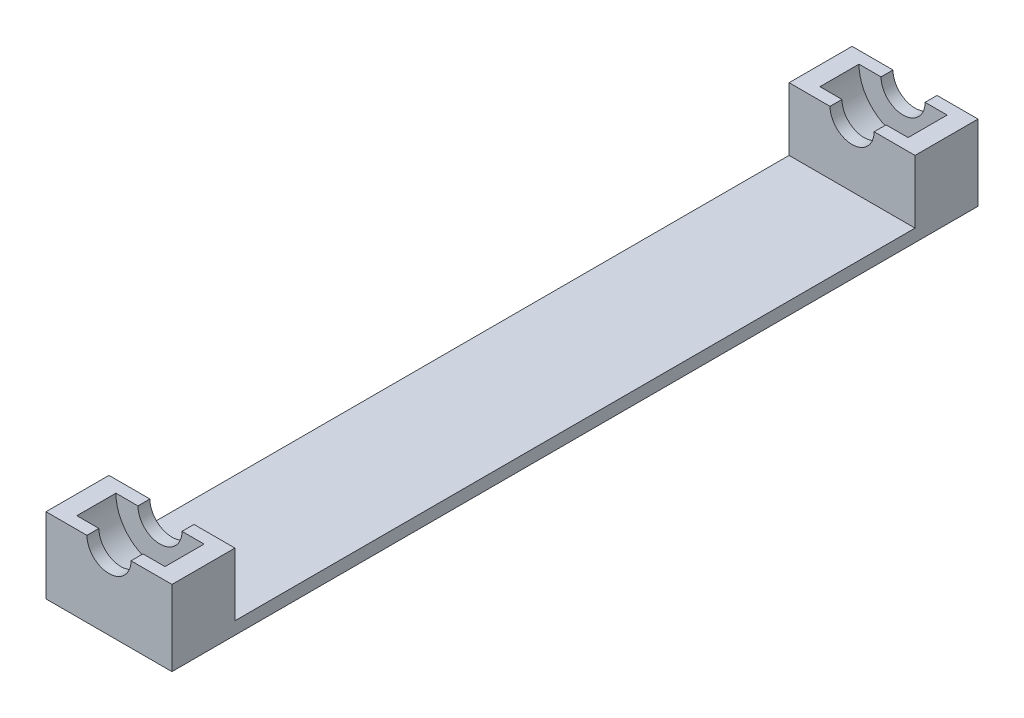
ISO-10303-21;
HEADER;
FILE_DESCRIPTION(('STEP AP214'),'2;1');
FILE_NAME('part.step','',(''),(''),'','','');
FILE_SCHEMA(('AUTOMOTIVE_DESIGN { 1 0 10303 214 1 1 1 1 }'));
ENDSEC;
DATA;
#1=APPLICATION_CONTEXT('core data for automotive mechanical design processes');
#2=APPLICATION_PROTOCOL_DEFINITION('international standard','automotive_design',2000,#1);
#3=PRODUCT_CONTEXT('',#1,'mechanical');
#4=PRODUCT('Part','Part','',(#3));
#5=PRODUCT_RELATED_PRODUCT_CATEGORY('part','',(#4));
#6=PRODUCT_DEFINITION_FORMATION('','',#4);
#7=PRODUCT_DEFINITION_CONTEXT('part definition',#1,'design');
#8=PRODUCT_DEFINITION('design','',#6,#7);
#9=PRODUCT_DEFINITION_SHAPE('','',#8);
#10=(LENGTH_UNIT() NAMED_UNIT(*) SI_UNIT(.MILLI.,.METRE.));
#11=(NAMED_UNIT(*) PLANE_ANGLE_UNIT() SI_UNIT($,.RADIAN.));
#12=(NAMED_UNIT(*) SI_UNIT($,.STERADIAN.) SOLID_ANGLE_UNIT());
#13=UNCERTAINTY_MEASURE_WITH_UNIT(LENGTH_MEASURE(1.E-05),#10,'distance_accuracy_value','');
#14=(GEOMETRIC_REPRESENTATION_CONTEXT(3) GLOBAL_UNCERTAINTY_ASSIGNED_CONTEXT((#13)) GLOBAL_UNIT_ASSIGNED_CONTEXT((#10,
#11,#12)) REPRESENTATION_CONTEXT('',''));
#15=CARTESIAN_POINT('',(0.,0.,0.));
#16=DIRECTION('',(0.,0.,1.));
#17=DIRECTION('',(1.,0.,0.));
#18=AXIS2_PLACEMENT_3D('',#15,#16,#17);
#19=CARTESIAN_POINT('',(10.,5.5,0.));
#20=DIRECTION('',(0.,1.,0.));
#21=DIRECTION('',(0.,0.,1.));
#22=AXIS2_PLACEMENT_3D('',#19,#20,#21);
#23=PLANE('',#22);
#24=DIRECTION('',(-1.,0.,0.));
#25=VECTOR('',#24,1.);
#26=CARTESIAN_POINT('',(10.,5.5,-32.));
#27=LINE('',#26,#25);
#28=CARTESIAN_POINT('',(10.,5.5,-32.));
#29=VERTEX_POINT('',#28);
#30=CARTESIAN_POINT('',(6.75,5.5,-32.));
#31=VERTEX_POINT('',#30);
#32=EDGE_CURVE('E191',#29,#31,#27,.T.);
#33=ORIENTED_EDGE('',*,*,#32,.T.);
#34=DIRECTION('',(0.,0.,-1.));
#35=VECTOR('',#34,1.);
#36=CARTESIAN_POINT('',(6.75,5.5,-22.9));
#37=LINE('',#36,#35);
#38=CARTESIAN_POINT('',(6.75,5.5,-31.05));
#39=VERTEX_POINT('',#38);
#40=EDGE_CURVE('E401',#31,#39,#37,.F.);
#41=ORIENTED_EDGE('',*,*,#40,.T.);
#42=DIRECTION('',(-1.,0.,0.));
#43=VECTOR('',#42,1.);
#44=CARTESIAN_POINT('',(10.,5.5,-31.05));
#45=LINE('',#44,#43);
#46=CARTESIAN_POINT('',(8.5,5.49999999999999,-31.05));
#47=VERTEX_POINT('',#46);
#48=EDGE_CURVE('E276',#47,#39,#45,.T.);
#49=ORIENTED_EDGE('',*,*,#48,.F.);
#50=DIRECTION('',(0.,0.,-1.));
#51=VECTOR('',#50,1.);
#52=CARTESIAN_POINT('',(8.5,5.5,-27.95));
#53=LINE('',#52,#51);
#54=CARTESIAN_POINT('',(8.5,5.49999999999999,-27.95));
#55=VERTEX_POINT('',#54);
#56=EDGE_CURVE('E12',#47,#55,#53,.F.);
#57=ORIENTED_EDGE('',*,*,#56,.T.);
#58=DIRECTION('',(-1.,0.,0.));
#59=VECTOR('',#58,1.);
#60=CARTESIAN_POINT('',(10.,5.5,-27.95));
#61=LINE('',#60,#59);
#62=CARTESIAN_POINT('',(6.75,5.49999999999999,-27.95));
#63=VERTEX_POINT('',#62);
#64=EDGE_CURVE('E75',#55,#63,#61,.T.);
#65=ORIENTED_EDGE('',*,*,#64,.T.);
#66=CARTESIAN_POINT('',(6.75,5.5,-27.));
#67=VERTEX_POINT('',#66);
#68=EDGE_CURVE('E301',#63,#67,#37,.F.);
#69=ORIENTED_EDGE('',*,*,#68,.T.);
#70=DIRECTION('',(-1.,0.,0.));
#71=VECTOR('',#70,1.);
#72=CARTESIAN_POINT('',(10.,5.5,-27.));
#73=LINE('',#72,#71);
#74=CARTESIAN_POINT('',(10.,5.5,-27.));
#75=VERTEX_POINT('',#74);
#76=EDGE_CURVE('E227',#75,#67,#73,.T.);
#77=ORIENTED_EDGE('',*,*,#76,.F.);
#78=DIRECTION('',(0.,0.,-1.));
#79=VECTOR('',#78,1.);
#80=CARTESIAN_POINT('',(10.,5.5,0.));
#81=LINE('',#80,#79);
#82=EDGE_CURVE('E203',#75,#29,#81,.T.);
#83=ORIENTED_EDGE('',*,*,#82,.T.);
#84=EDGE_LOOP('',(#33,#41,#49,#57,#65,#69,#77,#83));
#85=FACE_BOUND('',#84,.T.);
#86=ADVANCED_FACE('F65',(#85),#23,.T.);
#87=CARTESIAN_POINT('',(3.25,5.5,-27.));
#88=VERTEX_POINT('',#87);
#89=CARTESIAN_POINT('',(0.,5.5,-27.));
#90=VERTEX_POINT('',#89);
#91=EDGE_CURVE('E226',#88,#90,#73,.T.);
#92=ORIENTED_EDGE('',*,*,#91,.F.);
#93=DIRECTION('',(0.,0.,-1.));
#94=VECTOR('',#93,1.);
#95=CARTESIAN_POINT('',(3.25,5.5,-22.9));
#96=LINE('',#95,#94);
#97=CARTESIAN_POINT('',(3.25,5.49999999999999,-27.95));
#98=VERTEX_POINT('',#97);
#99=EDGE_CURVE('E461',#88,#98,#96,.T.);
#100=ORIENTED_EDGE('',*,*,#99,.T.);
#101=CARTESIAN_POINT('',(1.5,5.5,-27.95));
#102=VERTEX_POINT('',#101);
#103=EDGE_CURVE('E275',#98,#102,#61,.T.);
#104=ORIENTED_EDGE('',*,*,#103,.T.);
#105=DIRECTION('',(0.,0.,-1.));
#106=VECTOR('',#105,1.);
#107=CARTESIAN_POINT('',(1.5,5.5,-27.95));
#108=LINE('',#107,#106);
#109=CARTESIAN_POINT('',(1.5,5.5,-31.05));
#110=VERTEX_POINT('',#109);
#111=EDGE_CURVE('E279',#102,#110,#108,.T.);
#112=ORIENTED_EDGE('',*,*,#111,.T.);
#113=CARTESIAN_POINT('',(3.25,5.5,-31.05));
#114=VERTEX_POINT('',#113);
#115=EDGE_CURVE('E271',#114,#110,#45,.T.);
#116=ORIENTED_EDGE('',*,*,#115,.F.);
#117=CARTESIAN_POINT('',(3.25,5.5,-32.));
#118=VERTEX_POINT('',#117);
#119=EDGE_CURVE('E455',#114,#118,#96,.T.);
#120=ORIENTED_EDGE('',*,*,#119,.T.);
#121=CARTESIAN_POINT('',(0.,5.5,-32.));
#122=VERTEX_POINT('',#121);
#123=EDGE_CURVE('E231',#118,#122,#27,.T.);
#124=ORIENTED_EDGE('',*,*,#123,.T.);
#125=DIRECTION('',(0.,0.,-1.));
#126=VECTOR('',#125,1.);
#127=CARTESIAN_POINT('',(0.,5.5,0.));
#128=LINE('',#127,#126);
#129=EDGE_CURVE('E215',#90,#122,#128,.T.);
#130=ORIENTED_EDGE('',*,*,#129,.F.);
#131=EDGE_LOOP('',(#92,#100,#104,#112,#116,#120,#124,#130));
#132=FACE_BOUND('',#131,.T.);
#133=ADVANCED_FACE('F454',(#132),#23,.T.);
#134=CARTESIAN_POINT('',(10.,5.50000000000002,0.));
#135=DIRECTION('',(0.,-1.,0.));
#136=DIRECTION('',(0.,0.,-1.));
#137=AXIS2_PLACEMENT_3D('',#134,#135,#136);
#138=PLANE('',#137);
#139=DIRECTION('',(-1.,0.,0.));
#140=VECTOR('',#139,1.);
#141=CARTESIAN_POINT('',(10.,5.49999999999999,27.));
#142=LINE('',#141,#140);
#143=CARTESIAN_POINT('',(10.,5.49999999999999,27.));
#144=VERTEX_POINT('',#143);
#145=CARTESIAN_POINT('',(6.75,5.49999999999999,27.));
#146=VERTEX_POINT('',#145);
#147=EDGE_CURVE('E147',#144,#146,#142,.T.);
#148=ORIENTED_EDGE('',*,*,#147,.T.);
#149=DIRECTION('',(0.,0.,1.));
#150=VECTOR('',#149,1.);
#151=CARTESIAN_POINT('',(6.75,5.5,22.9));
#152=LINE('',#151,#150);
#153=CARTESIAN_POINT('',(6.75,5.49999999999999,27.95));
#154=VERTEX_POINT('',#153);
#155=EDGE_CURVE('E329',#146,#154,#152,.T.);
#156=ORIENTED_EDGE('',*,*,#155,.T.);
#157=DIRECTION('',(-1.,0.,0.));
#158=VECTOR('',#157,1.);
#159=CARTESIAN_POINT('',(10.,5.49999999999999,27.95));
#160=LINE('',#159,#158);
#161=CARTESIAN_POINT('',(8.5,5.49999999999999,27.95));
#162=VERTEX_POINT('',#161);
#163=EDGE_CURVE('E263',#162,#154,#160,.T.);
#164=ORIENTED_EDGE('',*,*,#163,.F.);
#165=DIRECTION('',(0.,0.,1.));
#166=VECTOR('',#165,1.);
#167=CARTESIAN_POINT('',(8.5,5.49999999999999,27.95));
#168=LINE('',#167,#166);
#169=CARTESIAN_POINT('',(8.5,5.49999999999999,31.05));
#170=VERTEX_POINT('',#169);
#171=EDGE_CURVE('E267',#162,#170,#168,.T.);
#172=ORIENTED_EDGE('',*,*,#171,.T.);
#173=DIRECTION('',(-1.,0.,0.));
#174=VECTOR('',#173,1.);
#175=CARTESIAN_POINT('',(10.,5.49999999999999,31.05));
#176=LINE('',#175,#174);
#177=CARTESIAN_POINT('',(6.75,5.49999999999999,31.05));
#178=VERTEX_POINT('',#177);
#179=EDGE_CURVE('E259',#170,#178,#176,.T.);
#180=ORIENTED_EDGE('',*,*,#179,.T.);
#181=CARTESIAN_POINT('',(6.75,5.5,32.));
#182=VERTEX_POINT('',#181);
#183=EDGE_CURVE('E322',#178,#182,#152,.T.);
#184=ORIENTED_EDGE('',*,*,#183,.T.);
#185=DIRECTION('',(-1.,0.,0.));
#186=VECTOR('',#185,1.);
#187=CARTESIAN_POINT('',(10.,5.49999999999999,32.));
#188=LINE('',#187,#186);
#189=CARTESIAN_POINT('',(10.,5.49999999999999,32.));
#190=VERTEX_POINT('',#189);
#191=EDGE_CURVE('E167',#190,#182,#188,.T.);
#192=ORIENTED_EDGE('',*,*,#191,.F.);
#193=DIRECTION('',(0.,0.,1.));
#194=VECTOR('',#193,1.);
#195=CARTESIAN_POINT('',(10.,5.50000000000002,0.));
#196=LINE('',#195,#194);
#197=EDGE_CURVE('E163',#144,#190,#196,.T.);
#198=ORIENTED_EDGE('',*,*,#197,.F.);
#199=EDGE_LOOP('',(#148,#156,#164,#172,#180,#184,#192,#198));
#200=FACE_BOUND('',#199,.T.);
#201=ADVANCED_FACE('F164',(#200),#138,.F.);
#202=CARTESIAN_POINT('',(10.,0.,27.));
#203=DIRECTION('',(0.,0.,-1.));
#204=DIRECTION('',(-1.,0.,0.));
#205=AXIS2_PLACEMENT_3D('',#202,#203,#204);
#206=PLANE('',#205);
#207=CARTESIAN_POINT('',(5.,5.49999999999999,27.));
#208=DIRECTION('',(0.,0.,-1.));
#209=DIRECTION('',(-1.,0.,0.));
#210=AXIS2_PLACEMENT_3D('',#207,#208,#209);
#211=CIRCLE('',#210,1.75);
#212=CARTESIAN_POINT('',(3.25,5.5,27.));
#213=VERTEX_POINT('',#212);
#214=EDGE_CURVE('E155',#146,#213,#211,.T.);
#215=ORIENTED_EDGE('',*,*,#214,.F.);
#216=ORIENTED_EDGE('',*,*,#147,.F.);
#217=DIRECTION('',(0.,-1.,0.));
#218=VECTOR('',#217,1.);
#219=CARTESIAN_POINT('',(10.,0.,27.));
#220=LINE('',#219,#218);
#221=CARTESIAN_POINT('',(10.,0.5,27.));
#222=VERTEX_POINT('',#221);
#223=EDGE_CURVE('E151',#144,#222,#220,.T.);
#224=ORIENTED_EDGE('',*,*,#223,.T.);
#225=DIRECTION('',(-1.,0.,0.));
#226=VECTOR('',#225,1.);
#227=CARTESIAN_POINT('',(10.,0.5,27.));
#228=LINE('',#227,#226);
#229=CARTESIAN_POINT('',(0.,0.5,27.));
#230=VERTEX_POINT('',#229);
#231=EDGE_CURVE('E83',#222,#230,#228,.T.);
#232=ORIENTED_EDGE('',*,*,#231,.T.);
#233=DIRECTION('',(0.,-1.,0.));
#234=VECTOR('',#233,1.);
#235=CARTESIAN_POINT('',(0.,0.,27.));
#236=LINE('',#235,#234);
#237=CARTESIAN_POINT('',(0.,5.49999999999999,27.));
#238=VERTEX_POINT('',#237);
#239=EDGE_CURVE('E187',#238,#230,#236,.T.);
#240=ORIENTED_EDGE('',*,*,#239,.F.);
#241=EDGE_CURVE('E160',#213,#238,#142,.T.);
#242=ORIENTED_EDGE('',*,*,#241,.F.);
#243=EDGE_LOOP('',(#215,#216,#224,#232,#240,#242));
#244=FACE_BOUND('',#243,.T.);
#245=ADVANCED_FACE('F149',(#244),#206,.T.);
#246=CARTESIAN_POINT('',(3.25,5.49999999999999,32.));
#247=VERTEX_POINT('',#246);
#248=CARTESIAN_POINT('',(0.,5.49999999999999,32.));
#249=VERTEX_POINT('',#248);
#250=EDGE_CURVE('E197',#247,#249,#188,.T.);
#251=ORIENTED_EDGE('',*,*,#250,.F.);
#252=DIRECTION('',(0.,0.,1.));
#253=VECTOR('',#252,1.);
#254=CARTESIAN_POINT('',(3.25,5.5,22.9));
#255=LINE('',#254,#253);
#256=CARTESIAN_POINT('',(3.25,5.49999999999999,31.05));
#257=VERTEX_POINT('',#256);
#258=EDGE_CURVE('E338',#247,#257,#255,.F.);
#259=ORIENTED_EDGE('',*,*,#258,.T.);
#260=CARTESIAN_POINT('',(1.5,5.49999999999999,31.05));
#261=VERTEX_POINT('',#260);
#262=EDGE_CURVE('E159',#257,#261,#176,.T.);
#263=ORIENTED_EDGE('',*,*,#262,.T.);
#264=DIRECTION('',(0.,0.,1.));
#265=VECTOR('',#264,1.);
#266=CARTESIAN_POINT('',(1.5,5.49999999999999,27.95));
#267=LINE('',#266,#265);
#268=CARTESIAN_POINT('',(1.5,5.49999999999999,27.95));
#269=VERTEX_POINT('',#268);
#270=EDGE_CURVE('E262',#261,#269,#267,.F.);
#271=ORIENTED_EDGE('',*,*,#270,.T.);
#272=CARTESIAN_POINT('',(3.25,5.49999999999999,27.95));
#273=VERTEX_POINT('',#272);
#274=EDGE_CURVE('E136',#273,#269,#160,.T.);
#275=ORIENTED_EDGE('',*,*,#274,.F.);
#276=EDGE_CURVE('E335',#273,#213,#255,.F.);
#277=ORIENTED_EDGE('',*,*,#276,.T.);
#278=ORIENTED_EDGE('',*,*,#241,.T.);
#279=DIRECTION('',(0.,0.,1.));
#280=VECTOR('',#279,1.);
#281=CARTESIAN_POINT('',(0.,5.50000000000002,0.));
#282=LINE('',#281,#280);
#283=EDGE_CURVE('E179',#238,#249,#282,.T.);
#284=ORIENTED_EDGE('',*,*,#283,.T.);
#285=EDGE_LOOP('',(#251,#259,#263,#271,#275,#277,#278,#284));
#286=FACE_BOUND('',#285,.T.);
#287=ADVANCED_FACE('F381',(#286),#138,.F.);
#288=CARTESIAN_POINT('',(10.,0.,32.));
#289=DIRECTION('',(0.,0.,-1.));
#290=DIRECTION('',(-1.,0.,0.));
#291=AXIS2_PLACEMENT_3D('',#288,#289,#290);
#292=PLANE('',#291);
#293=ORIENTED_EDGE('',*,*,#191,.T.);
#294=CARTESIAN_POINT('',(5.,5.49999999999999,32.));
#295=DIRECTION('',(0.,0.,-1.));
#296=DIRECTION('',(-1.,0.,0.));
#297=AXIS2_PLACEMENT_3D('',#294,#295,#296);
#298=CIRCLE('',#297,1.75);
#299=EDGE_CURVE('E327',#182,#247,#298,.T.);
#300=ORIENTED_EDGE('',*,*,#299,.T.);
#301=ORIENTED_EDGE('',*,*,#250,.T.);
#302=DIRECTION('',(0.,-1.,0.));
#303=VECTOR('',#302,1.);
#304=CARTESIAN_POINT('',(0.,0.,32.));
#305=LINE('',#304,#303);
#306=CARTESIAN_POINT('',(0.,-0.5,32.));
#307=VERTEX_POINT('',#306);
#308=EDGE_CURVE('E126',#249,#307,#305,.T.);
#309=ORIENTED_EDGE('',*,*,#308,.T.);
#310=DIRECTION('',(-1.,0.,0.));
#311=VECTOR('',#310,1.);
#312=CARTESIAN_POINT('',(10.,-0.5,32.));
#313=LINE('',#312,#311);
#314=CARTESIAN_POINT('',(10.,-0.5,32.));
#315=VERTEX_POINT('',#314);
#316=EDGE_CURVE('E216',#315,#307,#313,.T.);
#317=ORIENTED_EDGE('',*,*,#316,.F.);
#318=DIRECTION('',(0.,-1.,0.));
#319=VECTOR('',#318,1.);
#320=CARTESIAN_POINT('',(10.,0.,32.));
#321=LINE('',#320,#319);
#322=EDGE_CURVE('E171',#190,#315,#321,.T.);
#323=ORIENTED_EDGE('',*,*,#322,.F.);
#324=EDGE_LOOP('',(#293,#300,#301,#309,#317,#323));
#325=FACE_BOUND('',#324,.T.);
#326=ADVANCED_FACE('F375',(#325),#292,.F.);
#327=CARTESIAN_POINT('',(10.,0.,0.));
#328=DIRECTION('',(1.,0.,0.));
#329=DIRECTION('',(0.,0.,-1.));
#330=AXIS2_PLACEMENT_3D('',#327,#328,#329);
#331=PLANE('',#330);
#332=ORIENTED_EDGE('',*,*,#223,.F.);
#333=ORIENTED_EDGE('',*,*,#197,.T.);
#334=ORIENTED_EDGE('',*,*,#322,.T.);
#335=DIRECTION('',(0.,0.,-1.));
#336=VECTOR('',#335,1.);
#337=CARTESIAN_POINT('',(10.,-0.5,32.));
#338=LINE('',#337,#336);
#339=CARTESIAN_POINT('',(10.,-0.5,-32.));
#340=VERTEX_POINT('',#339);
#341=EDGE_CURVE('E235',#315,#340,#338,.T.);
#342=ORIENTED_EDGE('',*,*,#341,.T.);
#343=DIRECTION('',(0.,-1.,0.));
#344=VECTOR('',#343,1.);
#345=CARTESIAN_POINT('',(10.,0.,-32.));
#346=LINE('',#345,#344);
#347=EDGE_CURVE('E200',#29,#340,#346,.T.);
#348=ORIENTED_EDGE('',*,*,#347,.F.);
#349=ORIENTED_EDGE('',*,*,#82,.F.);
#350=DIRECTION('',(0.,-1.,0.));
#351=VECTOR('',#350,1.);
#352=CARTESIAN_POINT('',(10.,0.,-27.));
#353=LINE('',#352,#351);
#354=CARTESIAN_POINT('',(10.,0.5,-27.));
#355=VERTEX_POINT('',#354);
#356=EDGE_CURVE('E208',#75,#355,#353,.T.);
#357=ORIENTED_EDGE('',*,*,#356,.T.);
#358=DIRECTION('',(0.,0.,-1.));
#359=VECTOR('',#358,1.);
#360=CARTESIAN_POINT('',(10.,0.5,32.));
#361=LINE('',#360,#359);
#362=EDGE_CURVE('E175',#222,#355,#361,.T.);
#363=ORIENTED_EDGE('',*,*,#362,.F.);
#364=EDGE_LOOP('',(#332,#333,#334,#342,#348,#349,#357,#363));
#365=FACE_BOUND('',#364,.T.);
#366=ADVANCED_FACE('F173',(#365),#331,.T.);
#367=CARTESIAN_POINT('',(0.,0.,0.));
#368=DIRECTION('',(1.,0.,0.));
#369=DIRECTION('',(0.,0.,-1.));
#370=AXIS2_PLACEMENT_3D('',#367,#368,#369);
#371=PLANE('',#370);
#372=ORIENTED_EDGE('',*,*,#239,.T.);
#373=DIRECTION('',(0.,0.,-1.));
#374=VECTOR('',#373,1.);
#375=CARTESIAN_POINT('',(0.,0.5,32.));
#376=LINE('',#375,#374);
#377=CARTESIAN_POINT('',(0.,0.5,-27.));
#378=VERTEX_POINT('',#377);
#379=EDGE_CURVE('E239',#230,#378,#376,.T.);
#380=ORIENTED_EDGE('',*,*,#379,.T.);
#381=DIRECTION('',(0.,-1.,0.));
#382=VECTOR('',#381,1.);
#383=CARTESIAN_POINT('',(0.,0.,-27.));
#384=LINE('',#383,#382);
#385=EDGE_CURVE('E204',#90,#378,#384,.T.);
#386=ORIENTED_EDGE('',*,*,#385,.F.);
#387=ORIENTED_EDGE('',*,*,#129,.T.);
#388=DIRECTION('',(0.,-1.,0.));
#389=VECTOR('',#388,1.);
#390=CARTESIAN_POINT('',(0.,0.,-32.));
#391=LINE('',#390,#389);
#392=CARTESIAN_POINT('',(0.,-0.5,-32.));
#393=VERTEX_POINT('',#392);
#394=EDGE_CURVE('E212',#122,#393,#391,.T.);
#395=ORIENTED_EDGE('',*,*,#394,.T.);
#396=DIRECTION('',(0.,0.,-1.));
#397=VECTOR('',#396,1.);
#398=CARTESIAN_POINT('',(0.,-0.5,32.));
#399=LINE('',#398,#397);
#400=EDGE_CURVE('E243',#307,#393,#399,.T.);
#401=ORIENTED_EDGE('',*,*,#400,.F.);
#402=ORIENTED_EDGE('',*,*,#308,.F.);
#403=ORIENTED_EDGE('',*,*,#283,.F.);
#404=EDGE_LOOP('',(#372,#380,#386,#387,#395,#401,#402,#403));
#405=FACE_BOUND('',#404,.T.);
#406=ADVANCED_FACE('F384',(#405),#371,.F.);
#407=CARTESIAN_POINT('',(10.,0.,-32.));
#408=DIRECTION('',(0.,0.,-1.));
#409=DIRECTION('',(-1.,0.,0.));
#410=AXIS2_PLACEMENT_3D('',#407,#408,#409);
#411=PLANE('',#410);
#412=ORIENTED_EDGE('',*,*,#123,.F.);
#413=CARTESIAN_POINT('',(5.,5.49999999999999,-32.));
#414=DIRECTION('',(0.,0.,-1.));
#415=DIRECTION('',(-1.,0.,0.));
#416=AXIS2_PLACEMENT_3D('',#413,#414,#415);
#417=CIRCLE('',#416,1.75);
#418=EDGE_CURVE('E398',#118,#31,#417,.F.);
#419=ORIENTED_EDGE('',*,*,#418,.T.);
#420=ORIENTED_EDGE('',*,*,#32,.F.);
#421=ORIENTED_EDGE('',*,*,#347,.T.);
#422=DIRECTION('',(-1.,0.,0.));
#423=VECTOR('',#422,1.);
#424=CARTESIAN_POINT('',(10.,-0.5,-32.));
#425=LINE('',#424,#423);
#426=EDGE_CURVE('E242',#340,#393,#425,.T.);
#427=ORIENTED_EDGE('',*,*,#426,.T.);
#428=ORIENTED_EDGE('',*,*,#394,.F.);
#429=EDGE_LOOP('',(#412,#419,#420,#421,#427,#428));
#430=FACE_BOUND('',#429,.T.);
#431=ADVANCED_FACE('F394',(#430),#411,.T.);
#432=CARTESIAN_POINT('',(10.,0.,-27.));
#433=DIRECTION('',(0.,0.,-1.));
#434=DIRECTION('',(-1.,0.,0.));
#435=AXIS2_PLACEMENT_3D('',#432,#433,#434);
#436=PLANE('',#435);
#437=CARTESIAN_POINT('',(5.,5.49999999999999,-27.));
#438=DIRECTION('',(0.,0.,-1.));
#439=DIRECTION('',(-1.,0.,0.));
#440=AXIS2_PLACEMENT_3D('',#437,#438,#439);
#441=CIRCLE('',#440,1.75);
#442=EDGE_CURVE('E449',#88,#67,#441,.F.);
#443=ORIENTED_EDGE('',*,*,#442,.F.);
#444=ORIENTED_EDGE('',*,*,#91,.T.);
#445=ORIENTED_EDGE('',*,*,#385,.T.);
#446=DIRECTION('',(-1.,0.,0.));
#447=VECTOR('',#446,1.);
#448=CARTESIAN_POINT('',(10.,0.5,-27.));
#449=LINE('',#448,#447);
#450=EDGE_CURVE('E211',#355,#378,#449,.T.);
#451=ORIENTED_EDGE('',*,*,#450,.F.);
#452=ORIENTED_EDGE('',*,*,#356,.F.);
#453=ORIENTED_EDGE('',*,*,#76,.T.);
#454=EDGE_LOOP('',(#443,#444,#445,#451,#452,#453));
#455=FACE_BOUND('',#454,.T.);
#456=ADVANCED_FACE('F447',(#455),#436,.F.);
#457=CARTESIAN_POINT('',(10.,-0.5,32.));
#458=DIRECTION('',(0.,1.,0.));
#459=DIRECTION('',(0.,0.,1.));
#460=AXIS2_PLACEMENT_3D('',#457,#458,#459);
#461=PLANE('',#460);
#462=ORIENTED_EDGE('',*,*,#400,.T.);
#463=ORIENTED_EDGE('',*,*,#426,.F.);
#464=ORIENTED_EDGE('',*,*,#341,.F.);
#465=ORIENTED_EDGE('',*,*,#316,.T.);
#466=EDGE_LOOP('',(#462,#463,#464,#465));
#467=FACE_BOUND('',#466,.T.);
#468=ADVANCED_FACE('F67',(#467),#461,.F.);
#469=CARTESIAN_POINT('',(10.,0.5,32.));
#470=DIRECTION('',(0.,1.,0.));
#471=DIRECTION('',(0.,0.,1.));
#472=AXIS2_PLACEMENT_3D('',#469,#470,#471);
#473=PLANE('',#472);
#474=ORIENTED_EDGE('',*,*,#231,.F.);
#475=ORIENTED_EDGE('',*,*,#362,.T.);
#476=ORIENTED_EDGE('',*,*,#450,.T.);
#477=ORIENTED_EDGE('',*,*,#379,.F.);
#478=EDGE_LOOP('',(#474,#475,#476,#477));
#479=FACE_BOUND('',#478,.T.);
#480=ADVANCED_FACE('F443',(#479),#473,.T.);
#481=CARTESIAN_POINT('',(5.,5.49999999999999,27.95));
#482=DIRECTION('',(0.,0.,1.));
#483=DIRECTION('',(1.,0.,0.));
#484=AXIS2_PLACEMENT_3D('',#481,#482,#483);
#485=CYLINDRICAL_SURFACE('',#484,3.5);
#486=CARTESIAN_POINT('',(5.,5.49999999999999,27.95));
#487=DIRECTION('',(0.,0.,1.));
#488=DIRECTION('',(1.,0.,0.));
#489=AXIS2_PLACEMENT_3D('',#486,#487,#488);
#490=CIRCLE('',#489,3.5);
#491=EDGE_CURVE('E247',#269,#162,#490,.T.);
#492=ORIENTED_EDGE('',*,*,#491,.F.);
#493=ORIENTED_EDGE('',*,*,#270,.F.);
#494=CARTESIAN_POINT('',(5.,5.49999999999999,31.05));
#495=DIRECTION('',(0.,0.,1.));
#496=DIRECTION('',(1.,0.,0.));
#497=AXIS2_PLACEMENT_3D('',#494,#495,#496);
#498=CIRCLE('',#497,3.5);
#499=EDGE_CURVE('E182',#261,#170,#498,.T.);
#500=ORIENTED_EDGE('',*,*,#499,.T.);
#501=ORIENTED_EDGE('',*,*,#171,.F.);
#502=EDGE_LOOP('',(#492,#493,#500,#501));
#503=FACE_BOUND('',#502,.T.);
#504=ADVANCED_FACE('F361',(#503),#485,.F.);
#505=CARTESIAN_POINT('',(5.,5.49999999999999,27.95));
#506=DIRECTION('',(0.,0.,1.));
#507=DIRECTION('',(1.,0.,0.));
#508=AXIS2_PLACEMENT_3D('',#505,#506,#507);
#509=PLANE('',#508);
#510=ORIENTED_EDGE('',*,*,#163,.T.);
#511=CARTESIAN_POINT('',(5.,5.49999999999999,27.95));
#512=DIRECTION('',(0.,0.,1.));
#513=DIRECTION('',(1.,0.,0.));
#514=AXIS2_PLACEMENT_3D('',#511,#512,#513);
#515=CIRCLE('',#514,1.75);
#516=EDGE_CURVE('E345',#273,#154,#515,.T.);
#517=ORIENTED_EDGE('',*,*,#516,.F.);
#518=ORIENTED_EDGE('',*,*,#274,.T.);
#519=ORIENTED_EDGE('',*,*,#491,.T.);
#520=EDGE_LOOP('',(#510,#517,#518,#519));
#521=FACE_BOUND('',#520,.T.);
#522=ADVANCED_FACE('F493',(#521),#509,.T.);
#523=CARTESIAN_POINT('',(5.,5.49999999999999,31.05));
#524=DIRECTION('',(0.,0.,1.));
#525=DIRECTION('',(1.,0.,0.));
#526=AXIS2_PLACEMENT_3D('',#523,#524,#525);
#527=PLANE('',#526);
#528=ORIENTED_EDGE('',*,*,#499,.F.);
#529=ORIENTED_EDGE('',*,*,#262,.F.);
#530=CARTESIAN_POINT('',(5.,5.49999999999999,31.05));
#531=DIRECTION('',(0.,0.,1.));
#532=DIRECTION('',(1.,0.,0.));
#533=AXIS2_PLACEMENT_3D('',#530,#531,#532);
#534=CIRCLE('',#533,1.75);
#535=EDGE_CURVE('E349',#257,#178,#534,.T.);
#536=ORIENTED_EDGE('',*,*,#535,.T.);
#537=ORIENTED_EDGE('',*,*,#179,.F.);
#538=EDGE_LOOP('',(#528,#529,#536,#537));
#539=FACE_BOUND('',#538,.T.);
#540=ADVANCED_FACE('F436',(#539),#527,.F.);
#541=CARTESIAN_POINT('',(5.,5.49999999999999,22.9));
#542=DIRECTION('',(0.,0.,1.));
#543=DIRECTION('',(1.,0.,0.));
#544=AXIS2_PLACEMENT_3D('',#541,#542,#543);
#545=CYLINDRICAL_SURFACE('',#544,1.75);
#546=ORIENTED_EDGE('',*,*,#299,.F.);
#547=ORIENTED_EDGE('',*,*,#183,.F.);
#548=ORIENTED_EDGE('',*,*,#535,.F.);
#549=ORIENTED_EDGE('',*,*,#258,.F.);
#550=EDGE_LOOP('',(#546,#547,#548,#549));
#551=FACE_BOUND('',#550,.T.);
#552=ADVANCED_FACE('F435',(#551),#545,.F.);
#553=ORIENTED_EDGE('',*,*,#214,.T.);
#554=ORIENTED_EDGE('',*,*,#276,.F.);
#555=ORIENTED_EDGE('',*,*,#516,.T.);
#556=ORIENTED_EDGE('',*,*,#155,.F.);
#557=EDGE_LOOP('',(#553,#554,#555,#556));
#558=FACE_BOUND('',#557,.T.);
#559=ADVANCED_FACE('F516',(#558),#545,.F.);
#560=CARTESIAN_POINT('',(5.,5.49999999999999,-27.95));
#561=DIRECTION('',(0.,0.,-1.));
#562=DIRECTION('',(1.,0.,0.));
#563=AXIS2_PLACEMENT_3D('',#560,#561,#562);
#564=PLANE('',#563);
#565=CARTESIAN_POINT('',(5.,5.49999999999999,-27.95));
#566=DIRECTION('',(0.,0.,1.));
#567=DIRECTION('',(1.,0.,0.));
#568=AXIS2_PLACEMENT_3D('',#565,#566,#567);
#569=CIRCLE('',#568,3.5);
#570=EDGE_CURVE('E313',#102,#55,#569,.T.);
#571=ORIENTED_EDGE('',*,*,#570,.F.);
#572=ORIENTED_EDGE('',*,*,#103,.F.);
#573=CARTESIAN_POINT('',(5.,5.49999999999999,-27.95));
#574=DIRECTION('',(0.,0.,1.));
#575=DIRECTION('',(1.,0.,0.));
#576=AXIS2_PLACEMENT_3D('',#573,#574,#575);
#577=CIRCLE('',#576,1.75);
#578=EDGE_CURVE('E315',#98,#63,#577,.T.);
#579=ORIENTED_EDGE('',*,*,#578,.T.);
#580=ORIENTED_EDGE('',*,*,#64,.F.);
#581=EDGE_LOOP('',(#571,#572,#579,#580));
#582=FACE_BOUND('',#581,.T.);
#583=ADVANCED_FACE('F310',(#582),#564,.T.);
#584=CARTESIAN_POINT('',(5.,5.49999999999999,-31.05));
#585=DIRECTION('',(0.,0.,-1.));
#586=DIRECTION('',(1.,0.,0.));
#587=AXIS2_PLACEMENT_3D('',#584,#585,#586);
#588=PLANE('',#587);
#589=ORIENTED_EDGE('',*,*,#48,.T.);
#590=CARTESIAN_POINT('',(5.,5.49999999999999,-31.05));
#591=DIRECTION('',(0.,0.,1.));
#592=DIRECTION('',(1.,0.,0.));
#593=AXIS2_PLACEMENT_3D('',#590,#591,#592);
#594=CIRCLE('',#593,1.75);
#595=EDGE_CURVE('E332',#114,#39,#594,.T.);
#596=ORIENTED_EDGE('',*,*,#595,.F.);
#597=ORIENTED_EDGE('',*,*,#115,.T.);
#598=CARTESIAN_POINT('',(5.,5.49999999999999,-31.05));
#599=DIRECTION('',(0.,0.,1.));
#600=DIRECTION('',(1.,0.,0.));
#601=AXIS2_PLACEMENT_3D('',#598,#599,#600);
#602=CIRCLE('',#601,3.5);
#603=EDGE_CURVE('E323',#110,#47,#602,.T.);
#604=ORIENTED_EDGE('',*,*,#603,.T.);
#605=EDGE_LOOP('',(#589,#596,#597,#604));
#606=FACE_BOUND('',#605,.T.);
#607=ADVANCED_FACE('F521',(#606),#588,.F.);
#608=CARTESIAN_POINT('',(5.,5.49999999999999,-27.95));
#609=DIRECTION('',(0.,0.,-1.));
#610=DIRECTION('',(-1.,0.,0.));
#611=AXIS2_PLACEMENT_3D('',#608,#609,#610);
#612=CYLINDRICAL_SURFACE('',#611,3.5);
#613=ORIENTED_EDGE('',*,*,#603,.F.);
#614=ORIENTED_EDGE('',*,*,#111,.F.);
#615=ORIENTED_EDGE('',*,*,#570,.T.);
#616=ORIENTED_EDGE('',*,*,#56,.F.);
#617=EDGE_LOOP('',(#613,#614,#615,#616));
#618=FACE_BOUND('',#617,.T.);
#619=ADVANCED_FACE('F319',(#618),#612,.F.);
#620=CARTESIAN_POINT('',(5.,5.49999999999999,-22.9));
#621=DIRECTION('',(0.,0.,-1.));
#622=DIRECTION('',(-1.,0.,0.));
#623=AXIS2_PLACEMENT_3D('',#620,#621,#622);
#624=CYLINDRICAL_SURFACE('',#623,1.75);
#625=ORIENTED_EDGE('',*,*,#418,.F.);
#626=ORIENTED_EDGE('',*,*,#119,.F.);
#627=ORIENTED_EDGE('',*,*,#595,.T.);
#628=ORIENTED_EDGE('',*,*,#40,.F.);
#629=EDGE_LOOP('',(#625,#626,#627,#628));
#630=FACE_BOUND('',#629,.T.);
#631=ADVANCED_FACE('F457',(#630),#624,.F.);
#632=ORIENTED_EDGE('',*,*,#578,.F.);
#633=ORIENTED_EDGE('',*,*,#99,.F.);
#634=ORIENTED_EDGE('',*,*,#442,.T.);
#635=ORIENTED_EDGE('',*,*,#68,.F.);
#636=EDGE_LOOP('',(#632,#633,#634,#635));
#637=FACE_BOUND('',#636,.T.);
#638=ADVANCED_FACE('F472',(#637),#624,.F.);
#639=CLOSED_SHELL('',(#86,#133,#201,#245,#287,#326,#366,#406,#431,#456,#468,#480,#504,#522,#540,
#552,#559,#583,#607,#619,#631,#638));
#640=MANIFOLD_SOLID_BREP('B2',#639);
#641=ADVANCED_BREP_SHAPE_REPRESENTATION('',(#18,#640),#14);
#642=SHAPE_DEFINITION_REPRESENTATION(#9,#641);
ENDSEC;
END-ISO-10303-21;
